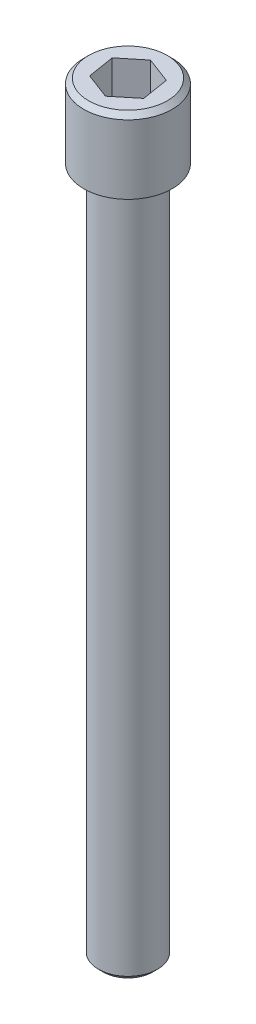
ISO-10303-21;
HEADER;
FILE_DESCRIPTION(('STEP AP214'),'2;1');
FILE_NAME('part.step','',(''),(''),'','','');
FILE_SCHEMA(('AUTOMOTIVE_DESIGN { 1 0 10303 214 1 1 1 1 }'));
ENDSEC;
DATA;
#1=APPLICATION_CONTEXT('core data for automotive mechanical design processes');
#2=APPLICATION_PROTOCOL_DEFINITION('international standard','automotive_design',2000,#1);
#3=PRODUCT_CONTEXT('',#1,'mechanical');
#4=PRODUCT('Part','Part','',(#3));
#5=PRODUCT_RELATED_PRODUCT_CATEGORY('part','',(#4));
#6=PRODUCT_DEFINITION_FORMATION('','',#4);
#7=PRODUCT_DEFINITION_CONTEXT('part definition',#1,'design');
#8=PRODUCT_DEFINITION('design','',#6,#7);
#9=PRODUCT_DEFINITION_SHAPE('','',#8);
#10=(LENGTH_UNIT() NAMED_UNIT(*) SI_UNIT(.MILLI.,.METRE.));
#11=(NAMED_UNIT(*) PLANE_ANGLE_UNIT() SI_UNIT($,.RADIAN.));
#12=(NAMED_UNIT(*) SI_UNIT($,.STERADIAN.) SOLID_ANGLE_UNIT());
#13=UNCERTAINTY_MEASURE_WITH_UNIT(LENGTH_MEASURE(1.E-05),#10,'distance_accuracy_value','');
#14=(GEOMETRIC_REPRESENTATION_CONTEXT(3) GLOBAL_UNCERTAINTY_ASSIGNED_CONTEXT((#13)) GLOBAL_UNIT_ASSIGNED_CONTEXT((#10,
#11,#12)) REPRESENTATION_CONTEXT('',''));
#15=CARTESIAN_POINT('',(0.,0.,0.));
#16=DIRECTION('',(0.,0.,1.));
#17=DIRECTION('',(1.,0.,0.));
#18=AXIS2_PLACEMENT_3D('',#15,#16,#17);
#19=CARTESIAN_POINT('',(0.,35.,0.));
#20=DIRECTION('',(0.,-1.,0.));
#21=DIRECTION('',(0.,0.,-1.));
#22=AXIS2_PLACEMENT_3D('',#19,#20,#21);
#23=CYLINDRICAL_SURFACE('',#22,1.5);
#24=CARTESIAN_POINT('',(0.,0.25,0.));
#25=DIRECTION('',(0.,1.,0.));
#26=DIRECTION('',(0.,0.,1.));
#27=AXIS2_PLACEMENT_3D('',#24,#25,#26);
#28=CIRCLE('',#27,1.5);
#29=CARTESIAN_POINT('',(0.,0.25,1.5));
#30=VERTEX_POINT('',#29);
#31=EDGE_CURVE('E41',#30,#30,#28,.T.);
#32=ORIENTED_EDGE('',*,*,#31,.T.);
#33=EDGE_LOOP('',(#32));
#34=FACE_BOUND('',#33,.T.);
#35=CARTESIAN_POINT('',(0.,35.,0.));
#36=DIRECTION('',(0.,1.,0.));
#37=DIRECTION('',(0.,0.,1.));
#38=AXIS2_PLACEMENT_3D('',#35,#36,#37);
#39=CIRCLE('',#38,1.5);
#40=CARTESIAN_POINT('',(0.,35.,1.5));
#41=VERTEX_POINT('',#40);
#42=EDGE_CURVE('E143',#41,#41,#39,.T.);
#43=ORIENTED_EDGE('',*,*,#42,.F.);
#44=EDGE_LOOP('',(#43));
#45=FACE_BOUND('',#44,.T.);
#46=ADVANCED_FACE('F33',(#34,#45),#23,.T.);
#47=CARTESIAN_POINT('',(0.,0.,0.));
#48=DIRECTION('',(0.,1.,0.));
#49=DIRECTION('',(0.,0.,1.));
#50=AXIS2_PLACEMENT_3D('',#47,#48,#49);
#51=PLANE('',#50);
#52=CARTESIAN_POINT('',(0.,0.,0.));
#53=DIRECTION('',(0.,1.,0.));
#54=DIRECTION('',(0.,0.,1.));
#55=AXIS2_PLACEMENT_3D('',#52,#53,#54);
#56=CIRCLE('',#55,1.25);
#57=CARTESIAN_POINT('',(0.,0.,1.25));
#58=VERTEX_POINT('',#57);
#59=EDGE_CURVE('E11',#58,#58,#56,.F.);
#60=ORIENTED_EDGE('',*,*,#59,.T.);
#61=EDGE_LOOP('',(#60));
#62=FACE_BOUND('',#61,.T.);
#63=ADVANCED_FACE('F165',(#62),#51,.F.);
#64=CARTESIAN_POINT('',(0.,38.75,0.));
#65=DIRECTION('',(0.,-1.,0.));
#66=DIRECTION('',(0.,0.,-1.));
#67=AXIS2_PLACEMENT_3D('',#64,#65,#66);
#68=CYLINDRICAL_SURFACE('',#67,2.25);
#69=CARTESIAN_POINT('',(0.,38.5,0.));
#70=DIRECTION('',(0.,1.,0.));
#71=DIRECTION('',(0.,0.,1.));
#72=AXIS2_PLACEMENT_3D('',#69,#70,#71);
#73=CIRCLE('',#72,2.25);
#74=CARTESIAN_POINT('',(0.,38.5,2.25));
#75=VERTEX_POINT('',#74);
#76=EDGE_CURVE('E149',#75,#75,#73,.F.);
#77=ORIENTED_EDGE('',*,*,#76,.T.);
#78=EDGE_LOOP('',(#77));
#79=FACE_BOUND('',#78,.T.);
#80=CARTESIAN_POINT('',(0.,35.,0.));
#81=DIRECTION('',(0.,1.,0.));
#82=DIRECTION('',(0.,0.,1.));
#83=AXIS2_PLACEMENT_3D('',#80,#81,#82);
#84=CIRCLE('',#83,2.25);
#85=CARTESIAN_POINT('',(0.,35.,2.25));
#86=VERTEX_POINT('',#85);
#87=EDGE_CURVE('E135',#86,#86,#84,.T.);
#88=ORIENTED_EDGE('',*,*,#87,.T.);
#89=EDGE_LOOP('',(#88));
#90=FACE_BOUND('',#89,.T.);
#91=ADVANCED_FACE('F170',(#79,#90),#68,.T.);
#92=CARTESIAN_POINT('',(0.,38.75,0.));
#93=DIRECTION('',(0.,1.,0.));
#94=DIRECTION('',(0.,0.,1.));
#95=AXIS2_PLACEMENT_3D('',#92,#93,#94);
#96=PLANE('',#95);
#97=CARTESIAN_POINT('',(0.,38.75,0.));
#98=DIRECTION('',(0.,1.,0.));
#99=DIRECTION('',(0.,0.,1.));
#100=AXIS2_PLACEMENT_3D('',#97,#98,#99);
#101=CIRCLE('',#100,2.);
#102=CARTESIAN_POINT('',(0.,38.75,2.));
#103=VERTEX_POINT('',#102);
#104=EDGE_CURVE('E146',#103,#103,#101,.T.);
#105=ORIENTED_EDGE('',*,*,#104,.T.);
#106=EDGE_LOOP('',(#105));
#107=FACE_BOUND('',#106,.T.);
#108=DIRECTION('',(0.159195520088402,0.,0.987247074639263));
#109=VECTOR('',#108,1.);
#110=CARTESIAN_POINT('',(-1.2949903812193,38.75,-0.492950213053497));
#111=LINE('',#110,#109);
#112=CARTESIAN_POINT('',(-1.2949903812193,38.75,-0.492950213053497));
#113=VERTEX_POINT('',#112);
#114=CARTESIAN_POINT('',(-1.07440259791493,38.75,0.875019461265662));
#115=VERTEX_POINT('',#114);
#116=EDGE_CURVE('E48',#113,#115,#111,.T.);
#117=ORIENTED_EDGE('',*,*,#116,.F.);
#118=DIRECTION('',(-0.775383286405273,0.,0.631490901884864));
#119=VECTOR('',#118,1.);
#120=CARTESIAN_POINT('',(-0.220587783304371,38.75,-1.36796967431916));
#121=LINE('',#120,#119);
#122=CARTESIAN_POINT('',(-0.220587783304371,38.75,-1.36796967431916));
#123=VERTEX_POINT('',#122);
#124=EDGE_CURVE('E131',#123,#113,#121,.T.);
#125=ORIENTED_EDGE('',*,*,#124,.F.);
#126=DIRECTION('',(-0.934578806493675,0.,-0.3557561727544));
#127=VECTOR('',#126,1.);
#128=CARTESIAN_POINT('',(1.07440259791493,38.75,-0.875019461265662));
#129=LINE('',#128,#127);
#130=CARTESIAN_POINT('',(1.07440259791493,38.75,-0.875019461265662));
#131=VERTEX_POINT('',#130);
#132=EDGE_CURVE('E129',#131,#123,#129,.T.);
#133=ORIENTED_EDGE('',*,*,#132,.F.);
#134=DIRECTION('',(-0.159195520088402,0.,-0.987247074639263));
#135=VECTOR('',#134,1.);
#136=CARTESIAN_POINT('',(1.2949903812193,38.75,0.492950213053496));
#137=LINE('',#136,#135);
#138=CARTESIAN_POINT('',(1.2949903812193,38.75,0.492950213053496));
#139=VERTEX_POINT('',#138);
#140=EDGE_CURVE('E96',#139,#131,#137,.T.);
#141=ORIENTED_EDGE('',*,*,#140,.F.);
#142=DIRECTION('',(0.775383286405273,0.,-0.631490901884864));
#143=VECTOR('',#142,1.);
#144=CARTESIAN_POINT('',(0.220587783304371,38.75,1.36796967431916));
#145=LINE('',#144,#143);
#146=CARTESIAN_POINT('',(0.220587783304371,38.75,1.36796967431916));
#147=VERTEX_POINT('',#146);
#148=EDGE_CURVE('E125',#147,#139,#145,.T.);
#149=ORIENTED_EDGE('',*,*,#148,.F.);
#150=DIRECTION('',(0.934578806493675,0.,0.3557561727544));
#151=VECTOR('',#150,1.);
#152=CARTESIAN_POINT('',(-1.07440259791493,38.75,0.875019461265662));
#153=LINE('',#152,#151);
#154=EDGE_CURVE('E122',#115,#147,#153,.T.);
#155=ORIENTED_EDGE('',*,*,#154,.F.);
#156=EDGE_LOOP('',(#117,#125,#133,#141,#149,#155));
#157=FACE_BOUND('',#156,.T.);
#158=ADVANCED_FACE('F176',(#107,#157),#96,.T.);
#159=CARTESIAN_POINT('',(0.,35.,0.));
#160=DIRECTION('',(0.,1.,0.));
#161=DIRECTION('',(0.,0.,1.));
#162=AXIS2_PLACEMENT_3D('',#159,#160,#161);
#163=PLANE('',#162);
#164=ORIENTED_EDGE('',*,*,#42,.T.);
#165=EDGE_LOOP('',(#164));
#166=FACE_BOUND('',#165,.T.);
#167=ORIENTED_EDGE('',*,*,#87,.F.);
#168=EDGE_LOOP('',(#167));
#169=FACE_BOUND('',#168,.T.);
#170=ADVANCED_FACE('F178',(#166,#169),#163,.F.);
#171=CARTESIAN_POINT('',(-1.2949903812193,36.5,-0.492950213053497));
#172=DIRECTION('',(-0.987247074639263,0.,0.159195520088402));
#173=DIRECTION('',(0.159195520088402,0.,0.987247074639263));
#174=AXIS2_PLACEMENT_3D('',#171,#172,#173);
#175=PLANE('',#174);
#176=ORIENTED_EDGE('',*,*,#116,.T.);
#177=DIRECTION('',(0.,1.,0.));
#178=VECTOR('',#177,1.);
#179=CARTESIAN_POINT('',(-1.07440259791493,36.5,0.875019461265662));
#180=LINE('',#179,#178);
#181=CARTESIAN_POINT('',(-1.07440259791493,36.5,0.875019461265662));
#182=VERTEX_POINT('',#181);
#183=EDGE_CURVE('E78',#182,#115,#180,.T.);
#184=ORIENTED_EDGE('',*,*,#183,.F.);
#185=DIRECTION('',(0.159195520088402,0.,0.987247074639263));
#186=VECTOR('',#185,1.);
#187=CARTESIAN_POINT('',(-1.2949903812193,36.5,-0.492950213053497));
#188=LINE('',#187,#186);
#189=CARTESIAN_POINT('',(-1.2949903812193,36.5,-0.492950213053497));
#190=VERTEX_POINT('',#189);
#191=EDGE_CURVE('E133',#190,#182,#188,.T.);
#192=ORIENTED_EDGE('',*,*,#191,.F.);
#193=DIRECTION('',(0.,1.,0.));
#194=VECTOR('',#193,1.);
#195=CARTESIAN_POINT('',(-1.2949903812193,36.5,-0.492950213053497));
#196=LINE('',#195,#194);
#197=EDGE_CURVE('E56',#190,#113,#196,.T.);
#198=ORIENTED_EDGE('',*,*,#197,.T.);
#199=EDGE_LOOP('',(#176,#184,#192,#198));
#200=FACE_BOUND('',#199,.T.);
#201=ADVANCED_FACE('F181',(#200),#175,.F.);
#202=CARTESIAN_POINT('',(-0.220587783304371,36.5,-1.36796967431916));
#203=DIRECTION('',(-0.631490901884864,0.,-0.775383286405273));
#204=DIRECTION('',(-0.775383286405273,0.,0.631490901884864));
#205=AXIS2_PLACEMENT_3D('',#202,#203,#204);
#206=PLANE('',#205);
#207=ORIENTED_EDGE('',*,*,#124,.T.);
#208=ORIENTED_EDGE('',*,*,#197,.F.);
#209=DIRECTION('',(-0.775383286405273,0.,0.631490901884864));
#210=VECTOR('',#209,1.);
#211=CARTESIAN_POINT('',(-0.220587783304371,36.5,-1.36796967431916));
#212=LINE('',#211,#210);
#213=CARTESIAN_POINT('',(-0.220587783304371,36.5,-1.36796967431916));
#214=VERTEX_POINT('',#213);
#215=EDGE_CURVE('E108',#214,#190,#212,.T.);
#216=ORIENTED_EDGE('',*,*,#215,.F.);
#217=DIRECTION('',(0.,1.,0.));
#218=VECTOR('',#217,1.);
#219=CARTESIAN_POINT('',(-0.220587783304371,36.5,-1.36796967431916));
#220=LINE('',#219,#218);
#221=EDGE_CURVE('E100',#214,#123,#220,.T.);
#222=ORIENTED_EDGE('',*,*,#221,.T.);
#223=EDGE_LOOP('',(#207,#208,#216,#222));
#224=FACE_BOUND('',#223,.T.);
#225=ADVANCED_FACE('F188',(#224),#206,.F.);
#226=CARTESIAN_POINT('',(1.07440259791493,36.5,-0.875019461265662));
#227=DIRECTION('',(0.3557561727544,0.,-0.934578806493675));
#228=DIRECTION('',(-0.934578806493675,0.,-0.3557561727544));
#229=AXIS2_PLACEMENT_3D('',#226,#227,#228);
#230=PLANE('',#229);
#231=ORIENTED_EDGE('',*,*,#132,.T.);
#232=ORIENTED_EDGE('',*,*,#221,.F.);
#233=DIRECTION('',(-0.934578806493675,0.,-0.3557561727544));
#234=VECTOR('',#233,1.);
#235=CARTESIAN_POINT('',(1.07440259791493,36.5,-0.875019461265662));
#236=LINE('',#235,#234);
#237=CARTESIAN_POINT('',(1.07440259791493,36.5,-0.875019461265662));
#238=VERTEX_POINT('',#237);
#239=EDGE_CURVE('E104',#238,#214,#236,.T.);
#240=ORIENTED_EDGE('',*,*,#239,.F.);
#241=DIRECTION('',(0.,1.,0.));
#242=VECTOR('',#241,1.);
#243=CARTESIAN_POINT('',(1.07440259791493,36.5,-0.875019461265662));
#244=LINE('',#243,#242);
#245=EDGE_CURVE('E89',#238,#131,#244,.T.);
#246=ORIENTED_EDGE('',*,*,#245,.T.);
#247=EDGE_LOOP('',(#231,#232,#240,#246));
#248=FACE_BOUND('',#247,.T.);
#249=ADVANCED_FACE('F105',(#248),#230,.F.);
#250=CARTESIAN_POINT('',(1.2949903812193,36.5,0.492950213053496));
#251=DIRECTION('',(0.987247074639263,0.,-0.159195520088402));
#252=DIRECTION('',(-0.159195520088403,0.,-0.987247074639263));
#253=AXIS2_PLACEMENT_3D('',#250,#251,#252);
#254=PLANE('',#253);
#255=ORIENTED_EDGE('',*,*,#140,.T.);
#256=ORIENTED_EDGE('',*,*,#245,.F.);
#257=DIRECTION('',(-0.159195520088402,0.,-0.987247074639263));
#258=VECTOR('',#257,1.);
#259=CARTESIAN_POINT('',(1.2949903812193,36.5,0.492950213053496));
#260=LINE('',#259,#258);
#261=CARTESIAN_POINT('',(1.2949903812193,36.5,0.492950213053496));
#262=VERTEX_POINT('',#261);
#263=EDGE_CURVE('E93',#262,#238,#260,.T.);
#264=ORIENTED_EDGE('',*,*,#263,.F.);
#265=DIRECTION('',(0.,1.,0.));
#266=VECTOR('',#265,1.);
#267=CARTESIAN_POINT('',(1.2949903812193,36.5,0.492950213053496));
#268=LINE('',#267,#266);
#269=EDGE_CURVE('E101',#262,#139,#268,.T.);
#270=ORIENTED_EDGE('',*,*,#269,.T.);
#271=EDGE_LOOP('',(#255,#256,#264,#270));
#272=FACE_BOUND('',#271,.T.);
#273=ADVANCED_FACE('F91',(#272),#254,.F.);
#274=CARTESIAN_POINT('',(0.220587783304371,36.5,1.36796967431916));
#275=DIRECTION('',(0.631490901884864,0.,0.775383286405273));
#276=DIRECTION('',(0.775383286405273,0.,-0.631490901884864));
#277=AXIS2_PLACEMENT_3D('',#274,#275,#276);
#278=PLANE('',#277);
#279=ORIENTED_EDGE('',*,*,#148,.T.);
#280=ORIENTED_EDGE('',*,*,#269,.F.);
#281=DIRECTION('',(0.775383286405273,0.,-0.631490901884864));
#282=VECTOR('',#281,1.);
#283=CARTESIAN_POINT('',(0.220587783304371,36.5,1.36796967431916));
#284=LINE('',#283,#282);
#285=CARTESIAN_POINT('',(0.220587783304371,36.5,1.36796967431916));
#286=VERTEX_POINT('',#285);
#287=EDGE_CURVE('E114',#286,#262,#284,.T.);
#288=ORIENTED_EDGE('',*,*,#287,.F.);
#289=DIRECTION('',(0.,1.,0.));
#290=VECTOR('',#289,1.);
#291=CARTESIAN_POINT('',(0.220587783304371,36.5,1.36796967431916));
#292=LINE('',#291,#290);
#293=EDGE_CURVE('E138',#286,#147,#292,.T.);
#294=ORIENTED_EDGE('',*,*,#293,.T.);
#295=EDGE_LOOP('',(#279,#280,#288,#294));
#296=FACE_BOUND('',#295,.T.);
#297=ADVANCED_FACE('F192',(#296),#278,.F.);
#298=CARTESIAN_POINT('',(-1.07440259791493,36.5,0.875019461265662));
#299=DIRECTION('',(-0.3557561727544,0.,0.934578806493675));
#300=DIRECTION('',(0.934578806493675,0.,0.3557561727544));
#301=AXIS2_PLACEMENT_3D('',#298,#299,#300);
#302=PLANE('',#301);
#303=ORIENTED_EDGE('',*,*,#154,.T.);
#304=ORIENTED_EDGE('',*,*,#293,.F.);
#305=DIRECTION('',(0.934578806493675,0.,0.3557561727544));
#306=VECTOR('',#305,1.);
#307=CARTESIAN_POINT('',(-1.07440259791493,36.5,0.875019461265662));
#308=LINE('',#307,#306);
#309=EDGE_CURVE('E116',#182,#286,#308,.T.);
#310=ORIENTED_EDGE('',*,*,#309,.F.);
#311=ORIENTED_EDGE('',*,*,#183,.T.);
#312=EDGE_LOOP('',(#303,#304,#310,#311));
#313=FACE_BOUND('',#312,.T.);
#314=ADVANCED_FACE('F189',(#313),#302,.F.);
#315=CARTESIAN_POINT('',(0.,36.5,0.));
#316=DIRECTION('',(0.,1.,0.));
#317=DIRECTION('',(0.,0.,1.));
#318=AXIS2_PLACEMENT_3D('',#315,#316,#317);
#319=PLANE('',#318);
#320=ORIENTED_EDGE('',*,*,#191,.T.);
#321=ORIENTED_EDGE('',*,*,#309,.T.);
#322=ORIENTED_EDGE('',*,*,#287,.T.);
#323=ORIENTED_EDGE('',*,*,#263,.T.);
#324=ORIENTED_EDGE('',*,*,#239,.T.);
#325=ORIENTED_EDGE('',*,*,#215,.T.);
#326=EDGE_LOOP('',(#320,#321,#322,#323,#324,#325));
#327=FACE_BOUND('',#326,.T.);
#328=ADVANCED_FACE('F111',(#327),#319,.T.);
#329=CARTESIAN_POINT('',(0.,38.75,0.));
#330=DIRECTION('',(0.,-1.,0.));
#331=DIRECTION('',(0.,0.,-1.));
#332=AXIS2_PLACEMENT_3D('',#329,#330,#331);
#333=CONICAL_SURFACE('',#332,2.,0.785398163397444);
#334=ORIENTED_EDGE('',*,*,#76,.F.);
#335=EDGE_LOOP('',(#334));
#336=FACE_BOUND('',#335,.T.);
#337=ORIENTED_EDGE('',*,*,#104,.F.);
#338=EDGE_LOOP('',(#337));
#339=FACE_BOUND('',#338,.T.);
#340=ADVANCED_FACE('F157',(#336,#339),#333,.T.);
#341=CARTESIAN_POINT('',(0.,0.25,0.));
#342=DIRECTION('',(0.,1.,0.));
#343=DIRECTION('',(0.,0.,1.));
#344=AXIS2_PLACEMENT_3D('',#341,#342,#343);
#345=CONICAL_SURFACE('',#344,1.5,0.785398163397445);
#346=ORIENTED_EDGE('',*,*,#59,.F.);
#347=EDGE_LOOP('',(#346));
#348=FACE_BOUND('',#347,.T.);
#349=ORIENTED_EDGE('',*,*,#31,.F.);
#350=EDGE_LOOP('',(#349));
#351=FACE_BOUND('',#350,.T.);
#352=ADVANCED_FACE('F35',(#348,#351),#345,.T.);
#353=CLOSED_SHELL('',(#46,#63,#91,#158,#170,#201,#225,#249,#273,#297,#314,#328,#340,#352));
#354=MANIFOLD_SOLID_BREP('B2',#353);
#355=ADVANCED_BREP_SHAPE_REPRESENTATION('',(#18,#354),#14);
#356=SHAPE_DEFINITION_REPRESENTATION(#9,#355);
ENDSEC;
END-ISO-10303-21;
